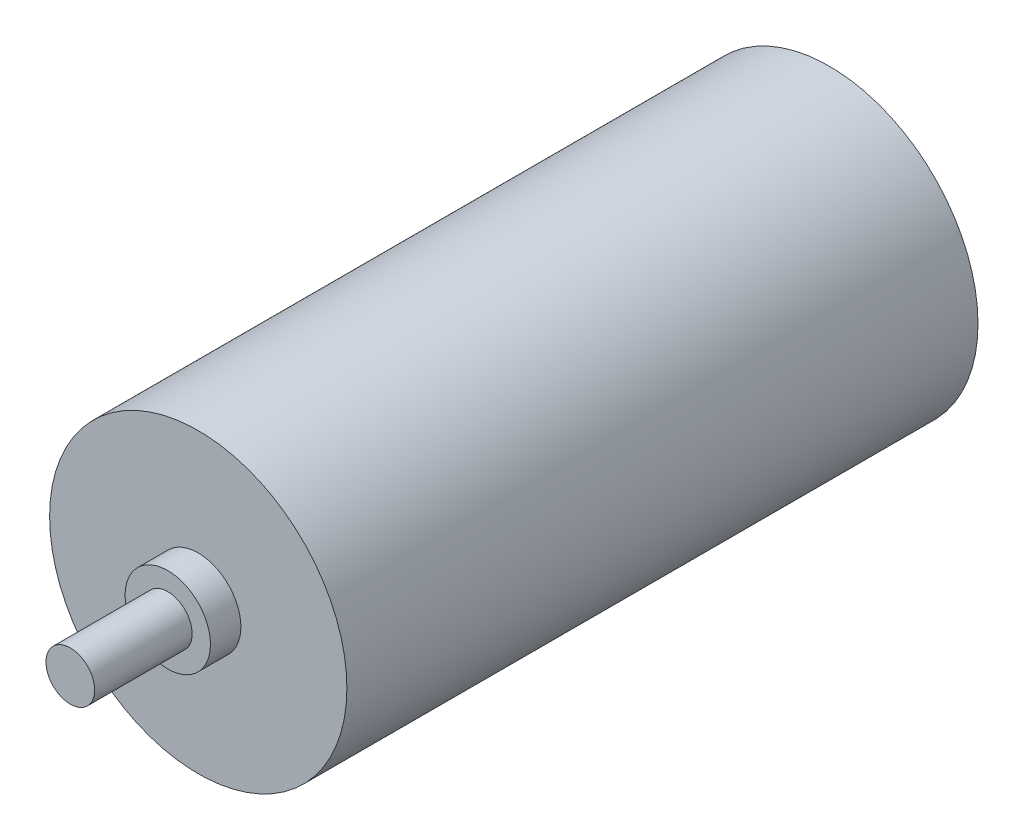
ISO-10303-21;
HEADER;
FILE_DESCRIPTION(('STEP AP214'),'2;1');
FILE_NAME('part.step','',(''),(''),'','','');
FILE_SCHEMA(('AUTOMOTIVE_DESIGN { 1 0 10303 214 1 1 1 1 }'));
ENDSEC;
DATA;
#1=APPLICATION_CONTEXT('core data for automotive mechanical design processes');
#2=APPLICATION_PROTOCOL_DEFINITION('international standard','automotive_design',2000,#1);
#3=PRODUCT_CONTEXT('',#1,'mechanical');
#4=PRODUCT('Part','Part','',(#3));
#5=PRODUCT_RELATED_PRODUCT_CATEGORY('part','',(#4));
#6=PRODUCT_DEFINITION_FORMATION('','',#4);
#7=PRODUCT_DEFINITION_CONTEXT('part definition',#1,'design');
#8=PRODUCT_DEFINITION('design','',#6,#7);
#9=PRODUCT_DEFINITION_SHAPE('','',#8);
#10=(LENGTH_UNIT() NAMED_UNIT(*) SI_UNIT(.MILLI.,.METRE.));
#11=(NAMED_UNIT(*) PLANE_ANGLE_UNIT() SI_UNIT($,.RADIAN.));
#12=(NAMED_UNIT(*) SI_UNIT($,.STERADIAN.) SOLID_ANGLE_UNIT());
#13=UNCERTAINTY_MEASURE_WITH_UNIT(LENGTH_MEASURE(1.E-05),#10,'distance_accuracy_value','');
#14=(GEOMETRIC_REPRESENTATION_CONTEXT(3) GLOBAL_UNCERTAINTY_ASSIGNED_CONTEXT((#13)) GLOBAL_UNIT_ASSIGNED_CONTEXT((#10,
#11,#12)) REPRESENTATION_CONTEXT('',''));
#15=CARTESIAN_POINT('',(0.,0.,0.));
#16=DIRECTION('',(0.,0.,1.));
#17=DIRECTION('',(1.,0.,0.));
#18=AXIS2_PLACEMENT_3D('',#15,#16,#17);
#19=CARTESIAN_POINT('',(0.,0.,51.8));
#20=DIRECTION('',(0.,0.,-1.));
#21=DIRECTION('',(-1.,0.,0.));
#22=AXIS2_PLACEMENT_3D('',#19,#20,#21);
#23=CYLINDRICAL_SURFACE('',#22,12.2);
#24=CARTESIAN_POINT('',(0.,0.,51.8));
#25=DIRECTION('',(0.,0.,1.));
#26=DIRECTION('',(1.,0.,0.));
#27=AXIS2_PLACEMENT_3D('',#24,#25,#26);
#28=CIRCLE('',#27,12.2);
#29=CARTESIAN_POINT('',(-12.2,0.,51.8));
#30=VERTEX_POINT('',#29);
#31=EDGE_CURVE('E46',#30,#30,#28,.T.);
#32=CARTESIAN_POINT('',(0.,0.,0.));
#33=DIRECTION('',(0.,0.,1.));
#34=DIRECTION('',(1.,0.,0.));
#35=AXIS2_PLACEMENT_3D('',#32,#33,#34);
#36=CIRCLE('',#35,12.2);
#37=CARTESIAN_POINT('',(-12.2,0.,0.));
#38=VERTEX_POINT('',#37);
#39=EDGE_CURVE('E37',#38,#38,#36,.T.);
#40=CARTESIAN_POINT('',(-12.2,0.,51.8));
#41=CARTESIAN_POINT('',(-12.2,0.,51.2604166666667));
#42=CARTESIAN_POINT('',(-12.2,0.,50.7208333333333));
#43=CARTESIAN_POINT('',(-12.2,0.,49.6416666666667));
#44=CARTESIAN_POINT('',(-12.2,0.,49.1020833333333));
#45=CARTESIAN_POINT('',(-12.2,0.,48.0229166666667));
#46=CARTESIAN_POINT('',(-12.2,0.,47.4833333333333));
#47=CARTESIAN_POINT('',(-12.2,0.,46.4041666666667));
#48=CARTESIAN_POINT('',(-12.2,0.,45.8645833333333));
#49=CARTESIAN_POINT('',(-12.2,0.,44.7854166666667));
#50=CARTESIAN_POINT('',(-12.2,0.,44.2458333333333));
#51=CARTESIAN_POINT('',(-12.2,0.,43.1666666666667));
#52=CARTESIAN_POINT('',(-12.2,0.,42.6270833333333));
#53=CARTESIAN_POINT('',(-12.2,0.,41.5479166666667));
#54=CARTESIAN_POINT('',(-12.2,0.,41.0083333333333));
#55=CARTESIAN_POINT('',(-12.2,0.,39.9291666666667));
#56=CARTESIAN_POINT('',(-12.2,0.,39.3895833333333));
#57=CARTESIAN_POINT('',(-12.2,0.,38.3104166666667));
#58=CARTESIAN_POINT('',(-12.2,0.,37.7708333333333));
#59=CARTESIAN_POINT('',(-12.2,0.,36.6916666666667));
#60=CARTESIAN_POINT('',(-12.2,0.,36.1520833333333));
#61=CARTESIAN_POINT('',(-12.2,0.,35.0729166666667));
#62=CARTESIAN_POINT('',(-12.2,0.,34.5333333333333));
#63=CARTESIAN_POINT('',(-12.2,0.,33.4541666666667));
#64=CARTESIAN_POINT('',(-12.2,0.,32.9145833333333));
#65=CARTESIAN_POINT('',(-12.2,0.,31.8354166666667));
#66=CARTESIAN_POINT('',(-12.2,0.,31.2958333333333));
#67=CARTESIAN_POINT('',(-12.2,0.,30.2166666666667));
#68=CARTESIAN_POINT('',(-12.2,0.,29.6770833333333));
#69=CARTESIAN_POINT('',(-12.2,0.,28.5979166666667));
#70=CARTESIAN_POINT('',(-12.2,0.,28.0583333333333));
#71=CARTESIAN_POINT('',(-12.2,0.,26.9791666666667));
#72=CARTESIAN_POINT('',(-12.2,0.,26.4395833333333));
#73=CARTESIAN_POINT('',(-12.2,0.,25.3604166666667));
#74=CARTESIAN_POINT('',(-12.2,0.,24.8208333333333));
#75=CARTESIAN_POINT('',(-12.2,0.,23.7416666666667));
#76=CARTESIAN_POINT('',(-12.2,0.,23.2020833333333));
#77=CARTESIAN_POINT('',(-12.2,0.,22.1229166666667));
#78=CARTESIAN_POINT('',(-12.2,0.,21.5833333333333));
#79=CARTESIAN_POINT('',(-12.2,0.,20.5041666666667));
#80=CARTESIAN_POINT('',(-12.2,0.,19.9645833333333));
#81=CARTESIAN_POINT('',(-12.2,0.,18.8854166666667));
#82=CARTESIAN_POINT('',(-12.2,0.,18.3458333333333));
#83=CARTESIAN_POINT('',(-12.2,0.,17.2666666666667));
#84=CARTESIAN_POINT('',(-12.2,0.,16.7270833333333));
#85=CARTESIAN_POINT('',(-12.2,0.,15.6479166666667));
#86=CARTESIAN_POINT('',(-12.2,0.,15.1083333333333));
#87=CARTESIAN_POINT('',(-12.2,0.,14.0291666666667));
#88=CARTESIAN_POINT('',(-12.2,0.,13.4895833333333));
#89=CARTESIAN_POINT('',(-12.2,0.,12.4104166666667));
#90=CARTESIAN_POINT('',(-12.2,0.,11.8708333333333));
#91=CARTESIAN_POINT('',(-12.2,0.,10.7916666666667));
#92=CARTESIAN_POINT('',(-12.2,0.,10.2520833333333));
#93=CARTESIAN_POINT('',(-12.2,0.,9.17291666666666));
#94=CARTESIAN_POINT('',(-12.2,0.,8.63333333333333));
#95=CARTESIAN_POINT('',(-12.2,0.,7.55416666666666));
#96=CARTESIAN_POINT('',(-12.2,0.,7.01458333333333));
#97=CARTESIAN_POINT('',(-12.2,0.,5.93541666666666));
#98=CARTESIAN_POINT('',(-12.2,0.,5.39583333333333));
#99=CARTESIAN_POINT('',(-12.2,0.,4.31666666666666));
#100=CARTESIAN_POINT('',(-12.2,0.,3.77708333333332));
#101=CARTESIAN_POINT('',(-12.2,0.,2.69791666666666));
#102=CARTESIAN_POINT('',(-12.2,0.,2.15833333333333));
#103=CARTESIAN_POINT('',(-12.2,0.,1.07916666666666));
#104=CARTESIAN_POINT('',(-12.2,0.,0.539583333333327));
#105=CARTESIAN_POINT('',(-12.2,0.,0.));
#106=B_SPLINE_CURVE_WITH_KNOTS('',3,(#40,#41,#42,#43,#44,#45,#46,#47,#48,#49,#50,#51,#52,#53,
#54,#55,#56,#57,#58,#59,#60,#61,#62,#63,#64,#65,#66,#67,#68,#69,#70,#71,#72,#73,#74,#75,#76,#77,
#78,#79,#80,#81,#82,#83,#84,#85,#86,#87,#88,#89,#90,#91,#92,#93,#94,#95,#96,#97,#98,#99,#100,
#101,#102,#103,#104,#105),.UNSPECIFIED.,.F.,.F.,(4,2,2,2,2,2,2,2,2,2,2,2,2,2,2,2,2,2,2,2,2,2,2,
2,2,2,2,2,2,2,2,2,4),(0.,1.61875,3.2375,4.85625,6.47499999999999,8.09375,9.71249999999999,
11.33125,12.95,14.56875,16.1875,17.80625,19.425,21.04375,22.6625,24.28125,25.9,27.51875,29.1375,
30.75625,32.375,33.99375,35.6125,37.23125,38.85,40.46875,42.0875,43.70625,45.325,46.94375,
48.5625,50.18125,51.8),.UNSPECIFIED.);
#107=EDGE_CURVE('BSEAM34',#30,#38,#106,.T.);
#108=ORIENTED_EDGE('',*,*,#31,.F.);
#109=ORIENTED_EDGE('',*,*,#39,.T.);
#110=ORIENTED_EDGE('',*,*,#107,.T.);
#111=ORIENTED_EDGE('',*,*,#107,.F.);
#112=EDGE_LOOP('',(#108,#110,#109,#111));
#113=FACE_BOUND('',#112,.T.);
#114=ADVANCED_FACE('F34',(#113),#23,.T.);
#115=CARTESIAN_POINT('',(0.,0.,51.8));
#116=DIRECTION('',(0.,0.,1.));
#117=DIRECTION('',(1.,0.,0.));
#118=AXIS2_PLACEMENT_3D('',#115,#116,#117);
#119=PLANE('',#118);
#120=CARTESIAN_POINT('',(0.,0.,51.8));
#121=DIRECTION('',(0.,0.,1.));
#122=DIRECTION('',(1.,0.,0.));
#123=AXIS2_PLACEMENT_3D('',#120,#121,#122);
#124=CIRCLE('',#123,3.5);
#125=CARTESIAN_POINT('',(3.5,0.,51.8));
#126=VERTEX_POINT('',#125);
#127=EDGE_CURVE('E41',#126,#126,#124,.T.);
#128=ORIENTED_EDGE('',*,*,#127,.F.);
#129=EDGE_LOOP('',(#128));
#130=FACE_BOUND('',#129,.T.);
#131=ORIENTED_EDGE('',*,*,#31,.T.);
#132=EDGE_LOOP('',(#131));
#133=FACE_BOUND('',#132,.T.);
#134=ADVANCED_FACE('F63',(#130,#133),#119,.T.);
#135=CARTESIAN_POINT('',(0.,0.,0.));
#136=DIRECTION('',(0.,0.,1.));
#137=DIRECTION('',(1.,0.,0.));
#138=AXIS2_PLACEMENT_3D('',#135,#136,#137);
#139=PLANE('',#138);
#140=ORIENTED_EDGE('',*,*,#39,.F.);
#141=EDGE_LOOP('',(#140));
#142=FACE_BOUND('',#141,.T.);
#143=ADVANCED_FACE('F60',(#142),#139,.F.);
#144=CARTESIAN_POINT('',(0.,0.,54.3));
#145=DIRECTION('',(0.,0.,-1.));
#146=DIRECTION('',(-1.,0.,0.));
#147=AXIS2_PLACEMENT_3D('',#144,#145,#146);
#148=CYLINDRICAL_SURFACE('',#147,3.5);
#149=CARTESIAN_POINT('',(0.,0.,54.3));
#150=DIRECTION('',(0.,0.,1.));
#151=DIRECTION('',(1.,0.,0.));
#152=AXIS2_PLACEMENT_3D('',#149,#150,#151);
#153=CIRCLE('',#152,3.5);
#154=CARTESIAN_POINT('',(3.5,0.,54.3));
#155=VERTEX_POINT('',#154);
#156=EDGE_CURVE('E51',#155,#155,#153,.T.);
#157=ORIENTED_EDGE('',*,*,#156,.F.);
#158=EDGE_LOOP('',(#157));
#159=FACE_BOUND('',#158,.T.);
#160=ORIENTED_EDGE('',*,*,#127,.T.);
#161=EDGE_LOOP('',(#160));
#162=FACE_BOUND('',#161,.T.);
#163=ADVANCED_FACE('F62',(#159,#162),#148,.T.);
#164=CARTESIAN_POINT('',(0.,0.,54.3));
#165=DIRECTION('',(0.,0.,1.));
#166=DIRECTION('',(1.,0.,0.));
#167=AXIS2_PLACEMENT_3D('',#164,#165,#166);
#168=PLANE('',#167);
#169=CARTESIAN_POINT('',(0.,0.,54.3));
#170=DIRECTION('',(0.,0.,1.));
#171=DIRECTION('',(1.,0.,0.));
#172=AXIS2_PLACEMENT_3D('',#169,#170,#171);
#173=CIRCLE('',#172,2.);
#174=CARTESIAN_POINT('',(2.,0.,54.3));
#175=VERTEX_POINT('',#174);
#176=EDGE_CURVE('E10',#175,#175,#173,.T.);
#177=ORIENTED_EDGE('',*,*,#176,.F.);
#178=EDGE_LOOP('',(#177));
#179=FACE_BOUND('',#178,.T.);
#180=ORIENTED_EDGE('',*,*,#156,.T.);
#181=EDGE_LOOP('',(#180));
#182=FACE_BOUND('',#181,.T.);
#183=ADVANCED_FACE('F68',(#179,#182),#168,.T.);
#184=CARTESIAN_POINT('',(0.,0.,62.3));
#185=DIRECTION('',(0.,0.,-1.));
#186=DIRECTION('',(-1.,0.,0.));
#187=AXIS2_PLACEMENT_3D('',#184,#185,#186);
#188=CYLINDRICAL_SURFACE('',#187,2.);
#189=CARTESIAN_POINT('',(0.,0.,62.3));
#190=DIRECTION('',(0.,0.,1.));
#191=DIRECTION('',(1.,0.,0.));
#192=AXIS2_PLACEMENT_3D('',#189,#190,#191);
#193=CIRCLE('',#192,2.);
#194=CARTESIAN_POINT('',(2.,0.,62.3));
#195=VERTEX_POINT('',#194);
#196=EDGE_CURVE('E50',#195,#195,#193,.T.);
#197=ORIENTED_EDGE('',*,*,#196,.F.);
#198=EDGE_LOOP('',(#197));
#199=FACE_BOUND('',#198,.T.);
#200=ORIENTED_EDGE('',*,*,#176,.T.);
#201=EDGE_LOOP('',(#200));
#202=FACE_BOUND('',#201,.T.);
#203=ADVANCED_FACE('F98',(#199,#202),#188,.T.);
#204=CARTESIAN_POINT('',(0.,0.,62.3));
#205=DIRECTION('',(0.,0.,1.));
#206=DIRECTION('',(1.,0.,0.));
#207=AXIS2_PLACEMENT_3D('',#204,#205,#206);
#208=PLANE('',#207);
#209=ORIENTED_EDGE('',*,*,#196,.T.);
#210=EDGE_LOOP('',(#209));
#211=FACE_BOUND('',#210,.T.);
#212=ADVANCED_FACE('F108',(#211),#208,.T.);
#213=CLOSED_SHELL('',(#114,#134,#143,#163,#183,#203,#212));
#214=MANIFOLD_SOLID_BREP('B2',#213);
#215=ADVANCED_BREP_SHAPE_REPRESENTATION('',(#18,#214),#14);
#216=SHAPE_DEFINITION_REPRESENTATION(#9,#215);
ENDSEC;
END-ISO-10303-21;
